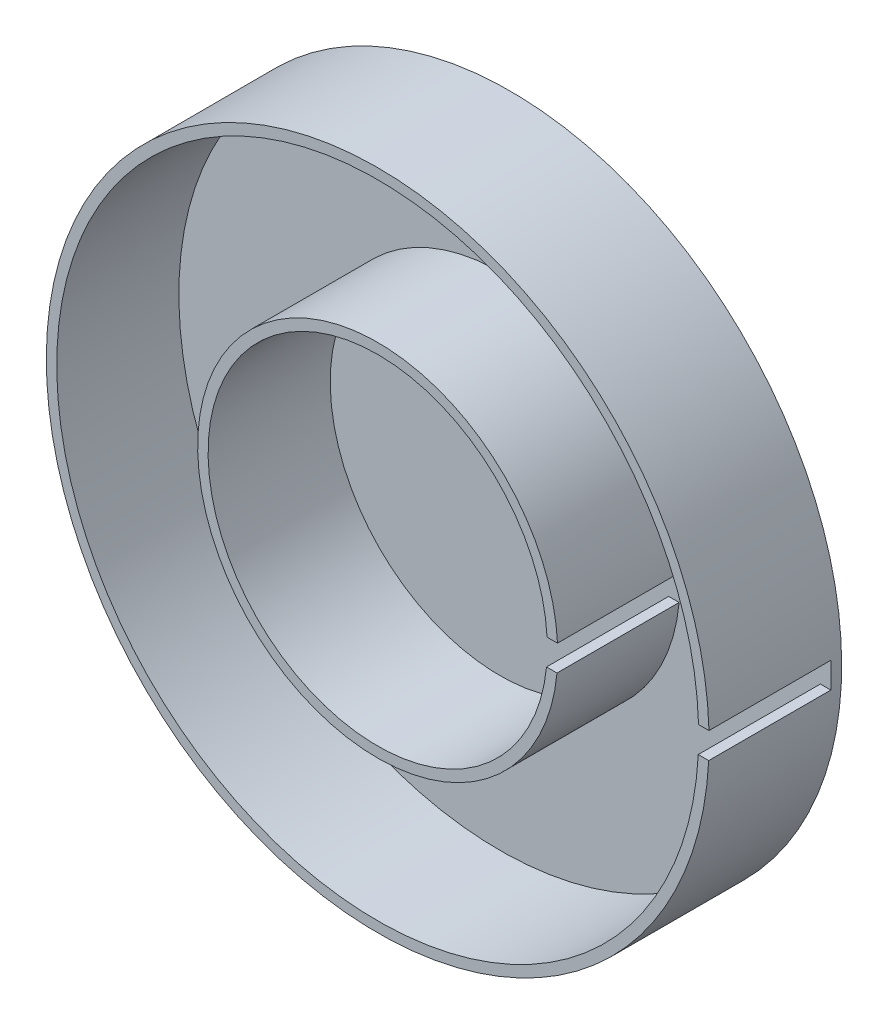
ISO-10303-21;
HEADER;
FILE_DESCRIPTION(('STEP AP214'),'2;1');
FILE_NAME('part.step','',(''),(''),'','','');
FILE_SCHEMA(('AUTOMOTIVE_DESIGN { 1 0 10303 214 1 1 1 1 }'));
ENDSEC;
DATA;
#1=APPLICATION_CONTEXT('core data for automotive mechanical design processes');
#2=APPLICATION_PROTOCOL_DEFINITION('international standard','automotive_design',2000,#1);
#3=PRODUCT_CONTEXT('',#1,'mechanical');
#4=PRODUCT('Part','Part','',(#3));
#5=PRODUCT_RELATED_PRODUCT_CATEGORY('part','',(#4));
#6=PRODUCT_DEFINITION_FORMATION('','',#4);
#7=PRODUCT_DEFINITION_CONTEXT('part definition',#1,'design');
#8=PRODUCT_DEFINITION('design','',#6,#7);
#9=PRODUCT_DEFINITION_SHAPE('','',#8);
#10=(LENGTH_UNIT() NAMED_UNIT(*) SI_UNIT(.MILLI.,.METRE.));
#11=(NAMED_UNIT(*) PLANE_ANGLE_UNIT() SI_UNIT($,.RADIAN.));
#12=(NAMED_UNIT(*) SI_UNIT($,.STERADIAN.) SOLID_ANGLE_UNIT());
#13=UNCERTAINTY_MEASURE_WITH_UNIT(LENGTH_MEASURE(1.E-05),#10,'distance_accuracy_value','');
#14=(GEOMETRIC_REPRESENTATION_CONTEXT(3) GLOBAL_UNCERTAINTY_ASSIGNED_CONTEXT((#13)) GLOBAL_UNIT_ASSIGNED_CONTEXT((#10,
#11,#12)) REPRESENTATION_CONTEXT('',''));
#15=CARTESIAN_POINT('',(0.,0.,0.));
#16=DIRECTION('',(0.,0.,1.));
#17=DIRECTION('',(1.,0.,0.));
#18=AXIS2_PLACEMENT_3D('',#15,#16,#17);
#19=CARTESIAN_POINT('',(0.,0.,2.));
#20=DIRECTION('',(0.,0.,1.));
#21=DIRECTION('',(1.,0.,0.));
#22=AXIS2_PLACEMENT_3D('',#19,#20,#21);
#23=PLANE('',#22);
#24=DIRECTION('',(-1.,0.,0.));
#25=VECTOR('',#24,1.);
#26=CARTESIAN_POINT('',(32.3431681129223,-3.18896165220637,2.));
#27=LINE('',#26,#25);
#28=CARTESIAN_POINT('',(34.3523001206725,-3.18896165220637,2.));
#29=VERTEX_POINT('',#28);
#30=CARTESIAN_POINT('',(32.3431681129223,-3.18896165220637,2.));
#31=VERTEX_POINT('',#30);
#32=EDGE_CURVE('E161',#29,#31,#27,.T.);
#33=ORIENTED_EDGE('',*,*,#32,.F.);
#34=CARTESIAN_POINT('',(0.,0.,2.));
#35=DIRECTION('',(0.,0.,1.));
#36=DIRECTION('',(1.,0.,0.));
#37=AXIS2_PLACEMENT_3D('',#34,#35,#36);
#38=CIRCLE('',#37,34.5);
#39=CARTESIAN_POINT('',(34.4524330070145,1.81103834779363,2.));
#40=VERTEX_POINT('',#39);
#41=EDGE_CURVE('E75',#40,#29,#38,.T.);
#42=ORIENTED_EDGE('',*,*,#41,.F.);
#43=DIRECTION('',(1.,0.,0.));
#44=VECTOR('',#43,1.);
#45=CARTESIAN_POINT('',(32.4495013845024,1.81103834779363,2.));
#46=LINE('',#45,#44);
#47=CARTESIAN_POINT('',(32.4495013845024,1.81103834779363,2.));
#48=VERTEX_POINT('',#47);
#49=EDGE_CURVE('E170',#48,#40,#46,.T.);
#50=ORIENTED_EDGE('',*,*,#49,.F.);
#51=CARTESIAN_POINT('',(0.,0.,2.));
#52=DIRECTION('',(0.,0.,-1.));
#53=DIRECTION('',(1.,0.,0.));
#54=AXIS2_PLACEMENT_3D('',#51,#52,#53);
#55=CIRCLE('',#54,32.5);
#56=EDGE_CURVE('E175',#31,#48,#55,.T.);
#57=ORIENTED_EDGE('',*,*,#56,.F.);
#58=EDGE_LOOP('',(#33,#42,#50,#57));
#59=FACE_BOUND('',#58,.T.);
#60=DIRECTION('',(1.,0.,0.));
#61=VECTOR('',#60,1.);
#62=CARTESIAN_POINT('',(34.4524330070145,1.81103834779363,2.));
#63=LINE('',#62,#61);
#64=CARTESIAN_POINT('',(61.4733286889755,1.81103834779363,2.));
#65=VERTEX_POINT('',#64);
#66=CARTESIAN_POINT('',(63.4741690776872,1.81103834779363,2.));
#67=VERTEX_POINT('',#66);
#68=EDGE_CURVE('E67',#65,#67,#63,.T.);
#69=ORIENTED_EDGE('',*,*,#68,.F.);
#70=CARTESIAN_POINT('',(0.,0.,2.));
#71=DIRECTION('',(0.,0.,1.));
#72=DIRECTION('',(1.,0.,0.));
#73=AXIS2_PLACEMENT_3D('',#70,#71,#72);
#74=CIRCLE('',#73,61.5);
#75=CARTESIAN_POINT('',(61.4172656797806,-3.18896165220636,2.));
#76=VERTEX_POINT('',#75);
#77=EDGE_CURVE('E183',#65,#76,#74,.T.);
#78=ORIENTED_EDGE('',*,*,#77,.T.);
#79=DIRECTION('',(-1.,0.,0.));
#80=VECTOR('',#79,1.);
#81=CARTESIAN_POINT('',(34.3523001206725,-3.18896165220636,2.));
#82=LINE('',#81,#80);
#83=CARTESIAN_POINT('',(63.4198748310083,-3.18896165220636,2.));
#84=VERTEX_POINT('',#83);
#85=EDGE_CURVE('E150',#84,#76,#82,.T.);
#86=ORIENTED_EDGE('',*,*,#85,.F.);
#87=CARTESIAN_POINT('',(0.,0.,2.));
#88=DIRECTION('',(0.,0.,1.));
#89=DIRECTION('',(1.,0.,0.));
#90=AXIS2_PLACEMENT_3D('',#87,#88,#89);
#91=CIRCLE('',#90,63.5);
#92=EDGE_CURVE('E135',#84,#67,#91,.T.);
#93=ORIENTED_EDGE('',*,*,#92,.T.);
#94=EDGE_LOOP('',(#69,#78,#86,#93));
#95=FACE_BOUND('',#94,.T.);
#96=ADVANCED_FACE('F51',(#59,#95),#23,.T.);
#97=CARTESIAN_POINT('',(0.,0.,25.4));
#98=DIRECTION('',(0.,0.,-1.));
#99=DIRECTION('',(-1.,0.,0.));
#100=AXIS2_PLACEMENT_3D('',#97,#98,#99);
#101=CYLINDRICAL_SURFACE('',#100,63.5);
#102=CARTESIAN_POINT('',(0.,0.,25.4));
#103=DIRECTION('',(0.,0.,1.));
#104=DIRECTION('',(1.,0.,0.));
#105=AXIS2_PLACEMENT_3D('',#102,#103,#104);
#106=CIRCLE('',#105,63.5);
#107=CARTESIAN_POINT('',(63.4741690776872,1.81103834779363,25.4));
#108=VERTEX_POINT('',#107);
#109=CARTESIAN_POINT('',(63.4198748310083,-3.18896165220636,25.4));
#110=VERTEX_POINT('',#109);
#111=EDGE_CURVE('E11',#108,#110,#106,.T.);
#112=ORIENTED_EDGE('',*,*,#111,.F.);
#113=DIRECTION('',(0.,0.,1.));
#114=VECTOR('',#113,1.);
#115=CARTESIAN_POINT('',(63.4741690776872,1.81103834779363,-34.0780323675168));
#116=LINE('',#115,#114);
#117=EDGE_CURVE('E137',#67,#108,#116,.T.);
#118=ORIENTED_EDGE('',*,*,#117,.F.);
#119=ORIENTED_EDGE('',*,*,#92,.F.);
#120=DIRECTION('',(0.,0.,1.));
#121=VECTOR('',#120,1.);
#122=CARTESIAN_POINT('',(63.4198748310083,-3.18896165220636,-34.0780323675168));
#123=LINE('',#122,#121);
#124=EDGE_CURVE('E120',#84,#110,#123,.T.);
#125=ORIENTED_EDGE('',*,*,#124,.T.);
#126=EDGE_LOOP('',(#112,#118,#119,#125));
#127=FACE_BOUND('',#126,.T.);
#128=CARTESIAN_POINT('',(0.,0.,0.));
#129=DIRECTION('',(0.,0.,1.));
#130=DIRECTION('',(1.,0.,0.));
#131=AXIS2_PLACEMENT_3D('',#128,#129,#130);
#132=CIRCLE('',#131,63.5);
#133=CARTESIAN_POINT('',(63.5,0.,0.));
#134=VERTEX_POINT('',#133);
#135=EDGE_CURVE('E55',#134,#134,#132,.T.);
#136=ORIENTED_EDGE('',*,*,#135,.T.);
#137=EDGE_LOOP('',(#136));
#138=FACE_BOUND('',#137,.T.);
#139=ADVANCED_FACE('F53',(#127,#138),#101,.T.);
#140=CARTESIAN_POINT('',(0.,0.,25.4));
#141=DIRECTION('',(0.,0.,1.));
#142=DIRECTION('',(1.,0.,0.));
#143=AXIS2_PLACEMENT_3D('',#140,#141,#142);
#144=PLANE('',#143);
#145=DIRECTION('',(-1.,0.,0.));
#146=VECTOR('',#145,1.);
#147=CARTESIAN_POINT('',(34.4524330070145,1.81103834779363,25.4));
#148=LINE('',#147,#146);
#149=CARTESIAN_POINT('',(61.4733286889755,1.81103834779363,25.4));
#150=VERTEX_POINT('',#149);
#151=EDGE_CURVE('E128',#108,#150,#148,.T.);
#152=ORIENTED_EDGE('',*,*,#151,.F.);
#153=ORIENTED_EDGE('',*,*,#111,.T.);
#154=DIRECTION('',(1.,0.,0.));
#155=VECTOR('',#154,1.);
#156=CARTESIAN_POINT('',(34.3523001206725,-3.18896165220636,25.4));
#157=LINE('',#156,#155);
#158=CARTESIAN_POINT('',(61.4172656797806,-3.18896165220636,25.4));
#159=VERTEX_POINT('',#158);
#160=EDGE_CURVE('E117',#159,#110,#157,.T.);
#161=ORIENTED_EDGE('',*,*,#160,.F.);
#162=CARTESIAN_POINT('',(0.,0.,25.4));
#163=DIRECTION('',(0.,0.,1.));
#164=DIRECTION('',(1.,0.,0.));
#165=AXIS2_PLACEMENT_3D('',#162,#163,#164);
#166=CIRCLE('',#165,61.5);
#167=EDGE_CURVE('E141',#150,#159,#166,.T.);
#168=ORIENTED_EDGE('',*,*,#167,.F.);
#169=EDGE_LOOP('',(#152,#153,#161,#168));
#170=FACE_BOUND('',#169,.T.);
#171=ADVANCED_FACE('F140',(#170),#144,.T.);
#172=CARTESIAN_POINT('',(0.,0.,0.));
#173=DIRECTION('',(0.,0.,1.));
#174=DIRECTION('',(1.,0.,0.));
#175=AXIS2_PLACEMENT_3D('',#172,#173,#174);
#176=PLANE('',#175);
#177=ORIENTED_EDGE('',*,*,#135,.F.);
#178=EDGE_LOOP('',(#177));
#179=FACE_BOUND('',#178,.T.);
#180=ADVANCED_FACE('F211',(#179),#176,.F.);
#181=CARTESIAN_POINT('',(0.,0.,25.4));
#182=DIRECTION('',(0.,0.,-1.));
#183=DIRECTION('',(-1.,0.,0.));
#184=AXIS2_PLACEMENT_3D('',#181,#182,#183);
#185=CYLINDRICAL_SURFACE('',#184,61.5);
#186=DIRECTION('',(0.,0.,-1.));
#187=VECTOR('',#186,1.);
#188=CARTESIAN_POINT('',(61.4733286889755,1.81103834779363,25.4));
#189=LINE('',#188,#187);
#190=EDGE_CURVE('E157',#150,#65,#189,.T.);
#191=ORIENTED_EDGE('',*,*,#190,.F.);
#192=ORIENTED_EDGE('',*,*,#167,.T.);
#193=DIRECTION('',(0.,0.,-1.));
#194=VECTOR('',#193,1.);
#195=CARTESIAN_POINT('',(61.4172656797806,-3.18896165220636,25.4));
#196=LINE('',#195,#194);
#197=EDGE_CURVE('E123',#76,#159,#196,.F.);
#198=ORIENTED_EDGE('',*,*,#197,.F.);
#199=ORIENTED_EDGE('',*,*,#77,.F.);
#200=EDGE_LOOP('',(#191,#192,#198,#199));
#201=FACE_BOUND('',#200,.T.);
#202=ADVANCED_FACE('F213',(#201),#185,.F.);
#203=CARTESIAN_POINT('',(0.,0.,122.947106659228));
#204=DIRECTION('',(0.,0.,-1.));
#205=DIRECTION('',(-1.,0.,0.));
#206=AXIS2_PLACEMENT_3D('',#203,#204,#205);
#207=CYLINDRICAL_SURFACE('',#206,32.5);
#208=CARTESIAN_POINT('',(0.,0.,25.4));
#209=DIRECTION('',(0.,0.,1.));
#210=DIRECTION('',(1.,0.,0.));
#211=AXIS2_PLACEMENT_3D('',#208,#209,#210);
#212=CIRCLE('',#211,32.5);
#213=CARTESIAN_POINT('',(32.3431681129223,-3.18896165220637,25.4));
#214=VERTEX_POINT('',#213);
#215=CARTESIAN_POINT('',(32.4495013845024,1.81103834779363,25.4));
#216=VERTEX_POINT('',#215);
#217=EDGE_CURVE('E188',#214,#216,#212,.F.);
#218=ORIENTED_EDGE('',*,*,#217,.F.);
#219=DIRECTION('',(0.,0.,-1.));
#220=VECTOR('',#219,1.);
#221=CARTESIAN_POINT('',(32.3431681129223,-3.18896165220637,122.947106659228));
#222=LINE('',#221,#220);
#223=EDGE_CURVE('E160',#214,#31,#222,.T.);
#224=ORIENTED_EDGE('',*,*,#223,.T.);
#225=ORIENTED_EDGE('',*,*,#56,.T.);
#226=DIRECTION('',(0.,0.,-1.));
#227=VECTOR('',#226,1.);
#228=CARTESIAN_POINT('',(32.4495013845024,1.81103834779363,122.947106659228));
#229=LINE('',#228,#227);
#230=EDGE_CURVE('E174',#216,#48,#229,.T.);
#231=ORIENTED_EDGE('',*,*,#230,.F.);
#232=EDGE_LOOP('',(#218,#224,#225,#231));
#233=FACE_BOUND('',#232,.T.);
#234=ADVANCED_FACE('F218',(#233),#207,.F.);
#235=CARTESIAN_POINT('',(32.4495013845024,1.81103834779363,122.947106659228));
#236=DIRECTION('',(0.,1.,0.));
#237=DIRECTION('',(0.,0.,1.));
#238=AXIS2_PLACEMENT_3D('',#235,#236,#237);
#239=PLANE('',#238);
#240=DIRECTION('',(1.,0.,0.));
#241=VECTOR('',#240,1.);
#242=CARTESIAN_POINT('',(32.4495013845024,1.81103834779363,25.4));
#243=LINE('',#242,#241);
#244=CARTESIAN_POINT('',(34.4524330070145,1.81103834779363,25.4));
#245=VERTEX_POINT('',#244);
#246=EDGE_CURVE('E184',#216,#245,#243,.T.);
#247=ORIENTED_EDGE('',*,*,#246,.F.);
#248=ORIENTED_EDGE('',*,*,#230,.T.);
#249=ORIENTED_EDGE('',*,*,#49,.T.);
#250=DIRECTION('',(0.,0.,-1.));
#251=VECTOR('',#250,1.);
#252=CARTESIAN_POINT('',(34.4524330070145,1.81103834779363,122.947106659228));
#253=LINE('',#252,#251);
#254=EDGE_CURVE('E169',#245,#40,#253,.T.);
#255=ORIENTED_EDGE('',*,*,#254,.F.);
#256=EDGE_LOOP('',(#247,#248,#249,#255));
#257=FACE_BOUND('',#256,.T.);
#258=ADVANCED_FACE('F238',(#257),#239,.F.);
#259=CARTESIAN_POINT('',(0.,0.,122.947106659228));
#260=DIRECTION('',(0.,0.,-1.));
#261=DIRECTION('',(-1.,0.,0.));
#262=AXIS2_PLACEMENT_3D('',#259,#260,#261);
#263=CYLINDRICAL_SURFACE('',#262,34.5);
#264=CARTESIAN_POINT('',(0.,0.,25.4));
#265=DIRECTION('',(0.,0.,1.));
#266=DIRECTION('',(1.,0.,0.));
#267=AXIS2_PLACEMENT_3D('',#264,#265,#266);
#268=CIRCLE('',#267,34.5);
#269=CARTESIAN_POINT('',(34.3523001206725,-3.18896165220636,25.4));
#270=VERTEX_POINT('',#269);
#271=EDGE_CURVE('E179',#245,#270,#268,.T.);
#272=ORIENTED_EDGE('',*,*,#271,.F.);
#273=ORIENTED_EDGE('',*,*,#254,.T.);
#274=ORIENTED_EDGE('',*,*,#41,.T.);
#275=DIRECTION('',(0.,0.,-1.));
#276=VECTOR('',#275,1.);
#277=CARTESIAN_POINT('',(34.3523001206725,-3.18896165220636,122.947106659228));
#278=LINE('',#277,#276);
#279=EDGE_CURVE('E166',#270,#29,#278,.T.);
#280=ORIENTED_EDGE('',*,*,#279,.F.);
#281=EDGE_LOOP('',(#272,#273,#274,#280));
#282=FACE_BOUND('',#281,.T.);
#283=ADVANCED_FACE('F242',(#282),#263,.T.);
#284=CARTESIAN_POINT('',(32.3431681129223,-3.18896165220637,122.947106659228));
#285=DIRECTION('',(0.,-1.,0.));
#286=DIRECTION('',(0.,0.,-1.));
#287=AXIS2_PLACEMENT_3D('',#284,#285,#286);
#288=PLANE('',#287);
#289=DIRECTION('',(-1.,0.,0.));
#290=VECTOR('',#289,1.);
#291=CARTESIAN_POINT('',(32.3431681129223,-3.18896165220637,25.4));
#292=LINE('',#291,#290);
#293=EDGE_CURVE('E165',#270,#214,#292,.T.);
#294=ORIENTED_EDGE('',*,*,#293,.F.);
#295=ORIENTED_EDGE('',*,*,#279,.T.);
#296=ORIENTED_EDGE('',*,*,#32,.T.);
#297=ORIENTED_EDGE('',*,*,#223,.F.);
#298=EDGE_LOOP('',(#294,#295,#296,#297));
#299=FACE_BOUND('',#298,.T.);
#300=ADVANCED_FACE('F234',(#299),#288,.F.);
#301=CARTESIAN_POINT('',(0.,0.,25.4));
#302=DIRECTION('',(0.,0.,1.));
#303=DIRECTION('',(1.,0.,0.));
#304=AXIS2_PLACEMENT_3D('',#301,#302,#303);
#305=PLANE('',#304);
#306=ORIENTED_EDGE('',*,*,#293,.T.);
#307=ORIENTED_EDGE('',*,*,#217,.T.);
#308=ORIENTED_EDGE('',*,*,#246,.T.);
#309=ORIENTED_EDGE('',*,*,#271,.T.);
#310=EDGE_LOOP('',(#306,#307,#308,#309));
#311=FACE_BOUND('',#310,.T.);
#312=ADVANCED_FACE('F231',(#311),#305,.T.);
#313=CARTESIAN_POINT('',(34.4524330070145,1.81103834779363,-34.0780323675168));
#314=DIRECTION('',(0.,1.,0.));
#315=DIRECTION('',(0.,0.,1.));
#316=AXIS2_PLACEMENT_3D('',#313,#314,#315);
#317=PLANE('',#316);
#318=ORIENTED_EDGE('',*,*,#190,.T.);
#319=ORIENTED_EDGE('',*,*,#68,.T.);
#320=ORIENTED_EDGE('',*,*,#117,.T.);
#321=ORIENTED_EDGE('',*,*,#151,.T.);
#322=EDGE_LOOP('',(#318,#319,#320,#321));
#323=FACE_BOUND('',#322,.T.);
#324=ADVANCED_FACE('F233',(#323),#317,.F.);
#325=CARTESIAN_POINT('',(34.3523001206725,-3.18896165220636,-34.0780323675168));
#326=DIRECTION('',(0.,-1.,0.));
#327=DIRECTION('',(0.,0.,-1.));
#328=AXIS2_PLACEMENT_3D('',#325,#326,#327);
#329=PLANE('',#328);
#330=ORIENTED_EDGE('',*,*,#197,.T.);
#331=ORIENTED_EDGE('',*,*,#160,.T.);
#332=ORIENTED_EDGE('',*,*,#124,.F.);
#333=ORIENTED_EDGE('',*,*,#85,.T.);
#334=EDGE_LOOP('',(#330,#331,#332,#333));
#335=FACE_BOUND('',#334,.T.);
#336=ADVANCED_FACE('F119',(#335),#329,.F.);
#337=CLOSED_SHELL('',(#96,#139,#171,#180,#202,#234,#258,#283,#300,#312,#324,#336));
#338=MANIFOLD_SOLID_BREP('B2',#337);
#339=ADVANCED_BREP_SHAPE_REPRESENTATION('',(#18,#338),#14);
#340=SHAPE_DEFINITION_REPRESENTATION(#9,#339);
ENDSEC;
END-ISO-10303-21;
